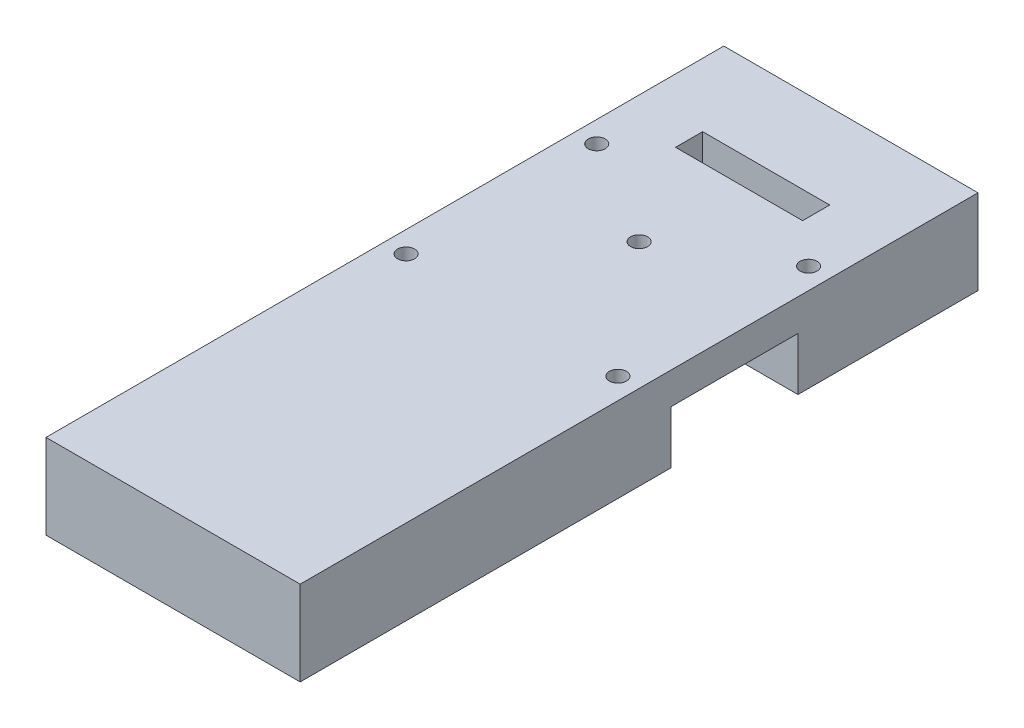
ISO-10303-21;
HEADER;
FILE_DESCRIPTION(('STEP AP214'),'2;1');
FILE_NAME('part.step','',(''),(''),'','','');
FILE_SCHEMA(('AUTOMOTIVE_DESIGN { 1 0 10303 214 1 1 1 1 }'));
ENDSEC;
DATA;
#1=APPLICATION_CONTEXT('core data for automotive mechanical design processes');
#2=APPLICATION_PROTOCOL_DEFINITION('international standard','automotive_design',2000,#1);
#3=PRODUCT_CONTEXT('',#1,'mechanical');
#4=PRODUCT('Part','Part','',(#3));
#5=PRODUCT_RELATED_PRODUCT_CATEGORY('part','',(#4));
#6=PRODUCT_DEFINITION_FORMATION('','',#4);
#7=PRODUCT_DEFINITION_CONTEXT('part definition',#1,'design');
#8=PRODUCT_DEFINITION('design','',#6,#7);
#9=PRODUCT_DEFINITION_SHAPE('','',#8);
#10=(LENGTH_UNIT() NAMED_UNIT(*) SI_UNIT(.MILLI.,.METRE.));
#11=(NAMED_UNIT(*) PLANE_ANGLE_UNIT() SI_UNIT($,.RADIAN.));
#12=(NAMED_UNIT(*) SI_UNIT($,.STERADIAN.) SOLID_ANGLE_UNIT());
#13=UNCERTAINTY_MEASURE_WITH_UNIT(LENGTH_MEASURE(1.E-05),#10,'distance_accuracy_value','');
#14=(GEOMETRIC_REPRESENTATION_CONTEXT(3) GLOBAL_UNCERTAINTY_ASSIGNED_CONTEXT((#13)) GLOBAL_UNIT_ASSIGNED_CONTEXT((#10,
#11,#12)) REPRESENTATION_CONTEXT('',''));
#15=CARTESIAN_POINT('',(0.,0.,0.));
#16=DIRECTION('',(0.,0.,1.));
#17=DIRECTION('',(1.,0.,0.));
#18=AXIS2_PLACEMENT_3D('',#15,#16,#17);
#19=CARTESIAN_POINT('',(0.,12.7,0.));
#20=DIRECTION('',(0.,-1.,0.));
#21=DIRECTION('',(0.,0.,-1.));
#22=AXIS2_PLACEMENT_3D('',#19,#20,#21);
#23=PLANE('',#22);
#24=CARTESIAN_POINT('',(31.75,12.7,-57.15));
#25=DIRECTION('',(0.,-1.,0.));
#26=DIRECTION('',(0.,0.,1.));
#27=AXIS2_PLACEMENT_3D('',#24,#25,#26);
#28=CIRCLE('',#27,2.5527);
#29=CARTESIAN_POINT('',(31.75,12.7,-54.5973));
#30=VERTEX_POINT('',#29);
#31=EDGE_CURVE('E817',#30,#30,#28,.T.);
#32=ORIENTED_EDGE('',*,*,#31,.T.);
#33=EDGE_LOOP('',(#32));
#34=FACE_BOUND('',#33,.T.);
#35=CARTESIAN_POINT('',(31.75,12.7,0.));
#36=DIRECTION('',(0.,-1.,0.));
#37=DIRECTION('',(0.,0.,1.));
#38=AXIS2_PLACEMENT_3D('',#35,#36,#37);
#39=CIRCLE('',#38,2.5527);
#40=CARTESIAN_POINT('',(31.75,12.7,2.55269999999999));
#41=VERTEX_POINT('',#40);
#42=EDGE_CURVE('E825',#41,#41,#39,.T.);
#43=ORIENTED_EDGE('',*,*,#42,.T.);
#44=EDGE_LOOP('',(#43));
#45=FACE_BOUND('',#44,.T.);
#46=CARTESIAN_POINT('',(-31.75,12.7,0.));
#47=DIRECTION('',(0.,-1.,0.));
#48=DIRECTION('',(0.,0.,-1.));
#49=AXIS2_PLACEMENT_3D('',#46,#47,#48);
#50=CIRCLE('',#49,2.5527);
#51=CARTESIAN_POINT('',(-31.75,12.7,-2.5527));
#52=VERTEX_POINT('',#51);
#53=EDGE_CURVE('E831',#52,#52,#50,.T.);
#54=ORIENTED_EDGE('',*,*,#53,.T.);
#55=EDGE_LOOP('',(#54));
#56=FACE_BOUND('',#55,.T.);
#57=CARTESIAN_POINT('',(-31.75,12.7,-57.15));
#58=DIRECTION('',(0.,-1.,0.));
#59=DIRECTION('',(0.,0.,-1.));
#60=AXIS2_PLACEMENT_3D('',#57,#58,#59);
#61=CIRCLE('',#60,2.5527);
#62=CARTESIAN_POINT('',(-31.75,12.7,-59.7027));
#63=VERTEX_POINT('',#62);
#64=EDGE_CURVE('E837',#63,#63,#61,.T.);
#65=ORIENTED_EDGE('',*,*,#64,.T.);
#66=EDGE_LOOP('',(#65));
#67=FACE_BOUND('',#66,.T.);
#68=CARTESIAN_POINT('',(0.,12.7,-38.1));
#69=DIRECTION('',(0.,1.,0.));
#70=DIRECTION('',(0.,0.,1.));
#71=AXIS2_PLACEMENT_3D('',#68,#69,#70);
#72=CIRCLE('',#71,2.5527);
#73=CARTESIAN_POINT('',(0.,12.7,-35.5473));
#74=VERTEX_POINT('',#73);
#75=EDGE_CURVE('E840',#74,#74,#72,.T.);
#76=ORIENTED_EDGE('',*,*,#75,.F.);
#77=EDGE_LOOP('',(#76));
#78=FACE_BOUND('',#77,.T.);
#79=DIRECTION('',(0.,0.,-1.));
#80=VECTOR('',#79,1.);
#81=CARTESIAN_POINT('',(38.1,12.7,101.6));
#82=LINE('',#81,#80);
#83=CARTESIAN_POINT('',(38.1,12.7,101.6));
#84=VERTEX_POINT('',#83);
#85=CARTESIAN_POINT('',(38.1,12.7,-101.6));
#86=VERTEX_POINT('',#85);
#87=EDGE_CURVE('E382',#84,#86,#82,.T.);
#88=ORIENTED_EDGE('',*,*,#87,.T.);
#89=DIRECTION('',(-1.,0.,0.));
#90=VECTOR('',#89,1.);
#91=CARTESIAN_POINT('',(-38.1,12.7,-101.6));
#92=LINE('',#91,#90);
#93=CARTESIAN_POINT('',(-38.1,12.7,-101.6));
#94=VERTEX_POINT('',#93);
#95=EDGE_CURVE('E386',#86,#94,#92,.T.);
#96=ORIENTED_EDGE('',*,*,#95,.T.);
#97=DIRECTION('',(0.,0.,1.));
#98=VECTOR('',#97,1.);
#99=CARTESIAN_POINT('',(-38.1,12.7,101.6));
#100=LINE('',#99,#98);
#101=CARTESIAN_POINT('',(-38.1,12.7,101.6));
#102=VERTEX_POINT('',#101);
#103=EDGE_CURVE('E389',#94,#102,#100,.T.);
#104=ORIENTED_EDGE('',*,*,#103,.T.);
#105=DIRECTION('',(1.,0.,0.));
#106=VECTOR('',#105,1.);
#107=CARTESIAN_POINT('',(-38.1,12.7,101.6));
#108=LINE('',#107,#106);
#109=EDGE_CURVE('E392',#102,#84,#108,.T.);
#110=ORIENTED_EDGE('',*,*,#109,.T.);
#111=EDGE_LOOP('',(#88,#96,#104,#110));
#112=FACE_BOUND('',#111,.T.);
#113=DIRECTION('',(0.,0.,-1.));
#114=VECTOR('',#113,1.);
#115=CARTESIAN_POINT('',(19.05,12.7,-76.2));
#116=LINE('',#115,#114);
#117=CARTESIAN_POINT('',(19.05,12.7,-68.072));
#118=VERTEX_POINT('',#117);
#119=CARTESIAN_POINT('',(19.05,12.7,-76.2));
#120=VERTEX_POINT('',#119);
#121=EDGE_CURVE('E220',#118,#120,#116,.T.);
#122=ORIENTED_EDGE('',*,*,#121,.F.);
#123=DIRECTION('',(1.,0.,0.));
#124=VECTOR('',#123,1.);
#125=CARTESIAN_POINT('',(19.05,12.7,-68.072));
#126=LINE('',#125,#124);
#127=CARTESIAN_POINT('',(-19.05,12.7,-68.072));
#128=VERTEX_POINT('',#127);
#129=EDGE_CURVE('E242',#128,#118,#126,.T.);
#130=ORIENTED_EDGE('',*,*,#129,.F.);
#131=DIRECTION('',(0.,0.,1.));
#132=VECTOR('',#131,1.);
#133=CARTESIAN_POINT('',(-19.05,12.7,-76.2));
#134=LINE('',#133,#132);
#135=CARTESIAN_POINT('',(-19.05,12.7,-76.2));
#136=VERTEX_POINT('',#135);
#137=EDGE_CURVE('E240',#136,#128,#134,.T.);
#138=ORIENTED_EDGE('',*,*,#137,.F.);
#139=DIRECTION('',(-1.,0.,0.));
#140=VECTOR('',#139,1.);
#141=CARTESIAN_POINT('',(19.05,12.7,-76.2));
#142=LINE('',#141,#140);
#143=EDGE_CURVE('E227',#120,#136,#142,.T.);
#144=ORIENTED_EDGE('',*,*,#143,.F.);
#145=EDGE_LOOP('',(#122,#130,#138,#144));
#146=FACE_BOUND('',#145,.T.);
#147=ADVANCED_FACE('F35',(#34,#45,#56,#67,#78,#112,#146),#23,.F.);
#148=CARTESIAN_POINT('',(-22.225,3.175,-73.025));
#149=DIRECTION('',(0.,-1.,0.));
#150=DIRECTION('',(0.,0.,-1.));
#151=AXIS2_PLACEMENT_3D('',#148,#149,#150);
#152=PLANE('',#151);
#153=DIRECTION('',(-1.,0.,0.));
#154=VECTOR('',#153,1.);
#155=CARTESIAN_POINT('',(-22.225,3.175,-68.072));
#156=LINE('',#155,#154);
#157=CARTESIAN_POINT('',(22.225,3.175,-68.072));
#158=VERTEX_POINT('',#157);
#159=CARTESIAN_POINT('',(19.05,3.175,-68.072));
#160=VERTEX_POINT('',#159);
#161=EDGE_CURVE('E267',#158,#160,#156,.T.);
#162=ORIENTED_EDGE('',*,*,#161,.T.);
#163=DIRECTION('',(0.,0.,-1.));
#164=VECTOR('',#163,1.);
#165=CARTESIAN_POINT('',(19.05,3.175,-73.0249999999999));
#166=LINE('',#165,#164);
#167=CARTESIAN_POINT('',(19.05,3.175,-76.2));
#168=VERTEX_POINT('',#167);
#169=EDGE_CURVE('E11',#160,#168,#166,.T.);
#170=ORIENTED_EDGE('',*,*,#169,.T.);
#171=DIRECTION('',(1.,0.,0.));
#172=VECTOR('',#171,1.);
#173=CARTESIAN_POINT('',(22.225,3.175,-76.2));
#174=LINE('',#173,#172);
#175=CARTESIAN_POINT('',(22.225,3.175,-76.2));
#176=VERTEX_POINT('',#175);
#177=EDGE_CURVE('E235',#168,#176,#174,.T.);
#178=ORIENTED_EDGE('',*,*,#177,.T.);
#179=CARTESIAN_POINT('',(22.225,3.175,-73.025));
#180=DIRECTION('',(0.,-1.,0.));
#181=DIRECTION('',(0.,0.,-1.));
#182=AXIS2_PLACEMENT_3D('',#179,#180,#181);
#183=CIRCLE('',#182,3.17500000000001);
#184=CARTESIAN_POINT('',(25.4,3.175,-73.025));
#185=VERTEX_POINT('',#184);
#186=EDGE_CURVE('E257',#176,#185,#183,.T.);
#187=ORIENTED_EDGE('',*,*,#186,.T.);
#188=DIRECTION('',(0.,0.,1.));
#189=VECTOR('',#188,1.);
#190=CARTESIAN_POINT('',(25.4,3.175,-71.247));
#191=LINE('',#190,#189);
#192=CARTESIAN_POINT('',(25.4,3.175,-71.247));
#193=VERTEX_POINT('',#192);
#194=EDGE_CURVE('E260',#185,#193,#191,.T.);
#195=ORIENTED_EDGE('',*,*,#194,.T.);
#196=CARTESIAN_POINT('',(22.225,3.175,-71.247));
#197=DIRECTION('',(0.,-1.,0.));
#198=DIRECTION('',(0.,0.,1.));
#199=AXIS2_PLACEMENT_3D('',#196,#197,#198);
#200=CIRCLE('',#199,3.175);
#201=EDGE_CURVE('E263',#193,#158,#200,.T.);
#202=ORIENTED_EDGE('',*,*,#201,.T.);
#203=EDGE_LOOP('',(#162,#170,#178,#187,#195,#202));
#204=FACE_BOUND('',#203,.T.);
#205=ADVANCED_FACE('F465',(#204),#152,.T.);
#206=CARTESIAN_POINT('',(-22.225,3.175,-76.2));
#207=VERTEX_POINT('',#206);
#208=CARTESIAN_POINT('',(-19.05,3.175,-76.2));
#209=VERTEX_POINT('',#208);
#210=EDGE_CURVE('E254',#207,#209,#174,.T.);
#211=ORIENTED_EDGE('',*,*,#210,.T.);
#212=DIRECTION('',(0.,0.,1.));
#213=VECTOR('',#212,1.);
#214=CARTESIAN_POINT('',(-19.05,3.175,-73.025));
#215=LINE('',#214,#213);
#216=CARTESIAN_POINT('',(-19.05,3.175,-68.072));
#217=VERTEX_POINT('',#216);
#218=EDGE_CURVE('E44',#209,#217,#215,.T.);
#219=ORIENTED_EDGE('',*,*,#218,.T.);
#220=CARTESIAN_POINT('',(-22.225,3.175,-68.072));
#221=VERTEX_POINT('',#220);
#222=EDGE_CURVE('E266',#217,#221,#156,.T.);
#223=ORIENTED_EDGE('',*,*,#222,.T.);
#224=CARTESIAN_POINT('',(-22.225,3.175,-71.247));
#225=DIRECTION('',(0.,-1.,0.));
#226=DIRECTION('',(0.,0.,-1.));
#227=AXIS2_PLACEMENT_3D('',#224,#225,#226);
#228=CIRCLE('',#227,3.175);
#229=CARTESIAN_POINT('',(-25.4,3.175,-71.247));
#230=VERTEX_POINT('',#229);
#231=EDGE_CURVE('E270',#221,#230,#228,.T.);
#232=ORIENTED_EDGE('',*,*,#231,.T.);
#233=DIRECTION('',(0.,0.,-1.));
#234=VECTOR('',#233,1.);
#235=CARTESIAN_POINT('',(-25.4,3.175,-71.247));
#236=LINE('',#235,#234);
#237=CARTESIAN_POINT('',(-25.4,3.175,-73.025));
#238=VERTEX_POINT('',#237);
#239=EDGE_CURVE('E273',#230,#238,#236,.T.);
#240=ORIENTED_EDGE('',*,*,#239,.T.);
#241=CARTESIAN_POINT('',(-22.225,3.175,-73.025));
#242=DIRECTION('',(0.,-1.,0.));
#243=DIRECTION('',(0.,0.,-1.));
#244=AXIS2_PLACEMENT_3D('',#241,#242,#243);
#245=CIRCLE('',#244,3.175);
#246=EDGE_CURVE('E250',#238,#207,#245,.T.);
#247=ORIENTED_EDGE('',*,*,#246,.T.);
#248=EDGE_LOOP('',(#211,#219,#223,#232,#240,#247));
#249=FACE_BOUND('',#248,.T.);
#250=ADVANCED_FACE('F432',(#249),#152,.T.);
#251=CARTESIAN_POINT('',(0.,-12.7,0.));
#252=DIRECTION('',(0.,-1.,0.));
#253=DIRECTION('',(0.,0.,-1.));
#254=AXIS2_PLACEMENT_3D('',#251,#252,#253);
#255=PLANE('',#254);
#256=CARTESIAN_POINT('',(31.75,-12.7,-57.15));
#257=DIRECTION('',(0.,-1.,0.));
#258=DIRECTION('',(0.,0.,1.));
#259=AXIS2_PLACEMENT_3D('',#256,#257,#258);
#260=CIRCLE('',#259,2.5527);
#261=CARTESIAN_POINT('',(31.75,-12.7,-54.5973));
#262=VERTEX_POINT('',#261);
#263=EDGE_CURVE('E820',#262,#262,#260,.T.);
#264=ORIENTED_EDGE('',*,*,#263,.F.);
#265=EDGE_LOOP('',(#264));
#266=FACE_BOUND('',#265,.T.);
#267=CARTESIAN_POINT('',(-31.75,-12.7,-57.15));
#268=DIRECTION('',(0.,-1.,0.));
#269=DIRECTION('',(0.,0.,-1.));
#270=AXIS2_PLACEMENT_3D('',#267,#268,#269);
#271=CIRCLE('',#270,2.5527);
#272=CARTESIAN_POINT('',(-31.75,-12.7,-59.7027));
#273=VERTEX_POINT('',#272);
#274=EDGE_CURVE('E834',#273,#273,#271,.T.);
#275=ORIENTED_EDGE('',*,*,#274,.F.);
#276=EDGE_LOOP('',(#275));
#277=FACE_BOUND('',#276,.T.);
#278=DIRECTION('',(1.,0.,0.));
#279=VECTOR('',#278,1.);
#280=CARTESIAN_POINT('',(22.225,-12.7,-76.2));
#281=LINE('',#280,#279);
#282=CARTESIAN_POINT('',(-22.225,-12.7,-76.2));
#283=VERTEX_POINT('',#282);
#284=CARTESIAN_POINT('',(-4.7625,-12.7,-76.2));
#285=VERTEX_POINT('',#284);
#286=EDGE_CURVE('E280',#283,#285,#281,.T.);
#287=ORIENTED_EDGE('',*,*,#286,.F.);
#288=CARTESIAN_POINT('',(-22.225,-12.7,-73.025));
#289=DIRECTION('',(0.,-1.,0.));
#290=DIRECTION('',(0.,0.,-1.));
#291=AXIS2_PLACEMENT_3D('',#288,#289,#290);
#292=CIRCLE('',#291,3.175);
#293=CARTESIAN_POINT('',(-25.4,-12.7,-73.025));
#294=VERTEX_POINT('',#293);
#295=EDGE_CURVE('E236',#294,#283,#292,.T.);
#296=ORIENTED_EDGE('',*,*,#295,.F.);
#297=DIRECTION('',(0.,0.,-1.));
#298=VECTOR('',#297,1.);
#299=CARTESIAN_POINT('',(-25.4,-12.7,-71.247));
#300=LINE('',#299,#298);
#301=CARTESIAN_POINT('',(-25.4,-12.7,-71.247));
#302=VERTEX_POINT('',#301);
#303=EDGE_CURVE('E253',#302,#294,#300,.T.);
#304=ORIENTED_EDGE('',*,*,#303,.F.);
#305=CARTESIAN_POINT('',(-22.225,-12.7,-71.247));
#306=DIRECTION('',(0.,-1.,0.));
#307=DIRECTION('',(0.,0.,-1.));
#308=AXIS2_PLACEMENT_3D('',#305,#306,#307);
#309=CIRCLE('',#308,3.175);
#310=CARTESIAN_POINT('',(-22.225,-12.7,-68.072));
#311=VERTEX_POINT('',#310);
#312=EDGE_CURVE('E294',#311,#302,#309,.T.);
#313=ORIENTED_EDGE('',*,*,#312,.F.);
#314=DIRECTION('',(-1.,0.,0.));
#315=VECTOR('',#314,1.);
#316=CARTESIAN_POINT('',(-22.225,-12.7,-68.072));
#317=LINE('',#316,#315);
#318=CARTESIAN_POINT('',(22.225,-12.7,-68.072));
#319=VERTEX_POINT('',#318);
#320=EDGE_CURVE('E291',#319,#311,#317,.T.);
#321=ORIENTED_EDGE('',*,*,#320,.F.);
#322=CARTESIAN_POINT('',(22.225,-12.7,-71.247));
#323=DIRECTION('',(0.,-1.,0.));
#324=DIRECTION('',(0.,0.,1.));
#325=AXIS2_PLACEMENT_3D('',#322,#323,#324);
#326=CIRCLE('',#325,3.175);
#327=CARTESIAN_POINT('',(25.4,-12.7,-71.247));
#328=VERTEX_POINT('',#327);
#329=EDGE_CURVE('E288',#328,#319,#326,.T.);
#330=ORIENTED_EDGE('',*,*,#329,.F.);
#331=DIRECTION('',(0.,0.,1.));
#332=VECTOR('',#331,1.);
#333=CARTESIAN_POINT('',(25.4,-12.7,-71.247));
#334=LINE('',#333,#332);
#335=CARTESIAN_POINT('',(25.4,-12.7,-73.025));
#336=VERTEX_POINT('',#335);
#337=EDGE_CURVE('E285',#336,#328,#334,.T.);
#338=ORIENTED_EDGE('',*,*,#337,.F.);
#339=CARTESIAN_POINT('',(22.225,-12.7,-73.025));
#340=DIRECTION('',(0.,-1.,0.));
#341=DIRECTION('',(0.,0.,-1.));
#342=AXIS2_PLACEMENT_3D('',#339,#340,#341);
#343=CIRCLE('',#342,3.17500000000001);
#344=CARTESIAN_POINT('',(22.225,-12.7,-76.2));
#345=VERTEX_POINT('',#344);
#346=EDGE_CURVE('E282',#345,#336,#343,.T.);
#347=ORIENTED_EDGE('',*,*,#346,.F.);
#348=CARTESIAN_POINT('',(4.7625,-12.7,-76.2));
#349=VERTEX_POINT('',#348);
#350=EDGE_CURVE('E279',#349,#345,#281,.T.);
#351=ORIENTED_EDGE('',*,*,#350,.F.);
#352=DIRECTION('',(0.,0.,-1.));
#353=VECTOR('',#352,1.);
#354=CARTESIAN_POINT('',(4.7625,-12.7,-76.2));
#355=LINE('',#354,#353);
#356=CARTESIAN_POINT('',(4.7625,-12.7,-101.6));
#357=VERTEX_POINT('',#356);
#358=EDGE_CURVE('E413',#357,#349,#355,.F.);
#359=ORIENTED_EDGE('',*,*,#358,.F.);
#360=DIRECTION('',(-1.,0.,0.));
#361=VECTOR('',#360,1.);
#362=CARTESIAN_POINT('',(-38.1,-12.7,-101.6));
#363=LINE('',#362,#361);
#364=CARTESIAN_POINT('',(38.1,-12.7,-101.6));
#365=VERTEX_POINT('',#364);
#366=EDGE_CURVE('E400',#365,#357,#363,.T.);
#367=ORIENTED_EDGE('',*,*,#366,.F.);
#368=DIRECTION('',(0.,0.,-1.));
#369=VECTOR('',#368,1.);
#370=CARTESIAN_POINT('',(38.1,-12.7,101.6));
#371=LINE('',#370,#369);
#372=CARTESIAN_POINT('',(38.1,-12.7,-47.625));
#373=VERTEX_POINT('',#372);
#374=EDGE_CURVE('E395',#373,#365,#371,.T.);
#375=ORIENTED_EDGE('',*,*,#374,.F.);
#376=DIRECTION('',(1.,0.,0.));
#377=VECTOR('',#376,1.);
#378=CARTESIAN_POINT('',(0.,-12.7,-47.625));
#379=LINE('',#378,#377);
#380=CARTESIAN_POINT('',(-38.1,-12.7,-47.625));
#381=VERTEX_POINT('',#380);
#382=EDGE_CURVE('E425',#381,#373,#379,.T.);
#383=ORIENTED_EDGE('',*,*,#382,.F.);
#384=DIRECTION('',(0.,0.,1.));
#385=VECTOR('',#384,1.);
#386=CARTESIAN_POINT('',(-38.1,-12.7,101.6));
#387=LINE('',#386,#385);
#388=CARTESIAN_POINT('',(-38.1,-12.7,-101.6));
#389=VERTEX_POINT('',#388);
#390=EDGE_CURVE('E404',#389,#381,#387,.T.);
#391=ORIENTED_EDGE('',*,*,#390,.F.);
#392=CARTESIAN_POINT('',(-4.7625,-12.7,-101.6));
#393=VERTEX_POINT('',#392);
#394=EDGE_CURVE('E399',#393,#389,#363,.T.);
#395=ORIENTED_EDGE('',*,*,#394,.F.);
#396=DIRECTION('',(0.,0.,-1.));
#397=VECTOR('',#396,1.);
#398=CARTESIAN_POINT('',(-4.7625,-12.7,-76.2));
#399=LINE('',#398,#397);
#400=EDGE_CURVE('E421',#285,#393,#399,.T.);
#401=ORIENTED_EDGE('',*,*,#400,.F.);
#402=EDGE_LOOP('',(#287,#296,#304,#313,#321,#330,#338,#347,#351,#359,#367,#375,#383,#391,#395,#401));
#403=FACE_BOUND('',#402,.T.);
#404=ADVANCED_FACE('F486',(#266,#277,#403),#255,.T.);
#405=CARTESIAN_POINT('',(38.1,-12.7,101.6));
#406=DIRECTION('',(1.,0.,0.));
#407=DIRECTION('',(0.,0.,-1.));
#408=AXIS2_PLACEMENT_3D('',#405,#406,#407);
#409=PLANE('',#408);
#410=DIRECTION('',(0.,1.,0.));
#411=VECTOR('',#410,1.);
#412=CARTESIAN_POINT('',(38.1,-12.7,-47.625));
#413=LINE('',#412,#411);
#414=CARTESIAN_POINT('',(38.1,3.175,-47.625));
#415=VERTEX_POINT('',#414);
#416=EDGE_CURVE('E374',#373,#415,#413,.T.);
#417=ORIENTED_EDGE('',*,*,#416,.F.);
#418=ORIENTED_EDGE('',*,*,#374,.T.);
#419=DIRECTION('',(0.,1.,0.));
#420=VECTOR('',#419,1.);
#421=CARTESIAN_POINT('',(38.1,-12.7,-101.6));
#422=LINE('',#421,#420);
#423=EDGE_CURVE('E410',#365,#86,#422,.T.);
#424=ORIENTED_EDGE('',*,*,#423,.T.);
#425=ORIENTED_EDGE('',*,*,#87,.F.);
#426=DIRECTION('',(0.,1.,0.));
#427=VECTOR('',#426,1.);
#428=CARTESIAN_POINT('',(38.1,-12.7,101.6));
#429=LINE('',#428,#427);
#430=CARTESIAN_POINT('',(38.1,-12.7,101.6));
#431=VERTEX_POINT('',#430);
#432=EDGE_CURVE('E411',#431,#84,#429,.T.);
#433=ORIENTED_EDGE('',*,*,#432,.F.);
#434=CARTESIAN_POINT('',(38.1,-12.7,-9.52500000000001));
#435=VERTEX_POINT('',#434);
#436=EDGE_CURVE('E396',#431,#435,#371,.T.);
#437=ORIENTED_EDGE('',*,*,#436,.T.);
#438=DIRECTION('',(0.,-1.,0.));
#439=VECTOR('',#438,1.);
#440=CARTESIAN_POINT('',(38.1,-12.7,-9.52500000000001));
#441=LINE('',#440,#439);
#442=CARTESIAN_POINT('',(38.1,3.175,-9.52500000000001));
#443=VERTEX_POINT('',#442);
#444=EDGE_CURVE('E358',#443,#435,#441,.T.);
#445=ORIENTED_EDGE('',*,*,#444,.F.);
#446=DIRECTION('',(0.,0.,-1.));
#447=VECTOR('',#446,1.);
#448=CARTESIAN_POINT('',(38.1,3.175,101.6));
#449=LINE('',#448,#447);
#450=EDGE_CURVE('E376',#443,#415,#449,.T.);
#451=ORIENTED_EDGE('',*,*,#450,.T.);
#452=EDGE_LOOP('',(#417,#418,#424,#425,#433,#437,#445,#451));
#453=FACE_BOUND('',#452,.T.);
#454=ADVANCED_FACE('F37',(#453),#409,.T.);
#455=CARTESIAN_POINT('',(-38.1,-12.7,101.6));
#456=DIRECTION('',(0.,0.,1.));
#457=DIRECTION('',(1.,0.,0.));
#458=AXIS2_PLACEMENT_3D('',#455,#456,#457);
#459=PLANE('',#458);
#460=ORIENTED_EDGE('',*,*,#432,.T.);
#461=ORIENTED_EDGE('',*,*,#109,.F.);
#462=DIRECTION('',(0.,1.,0.));
#463=VECTOR('',#462,1.);
#464=CARTESIAN_POINT('',(-38.1,-12.7,101.6));
#465=LINE('',#464,#463);
#466=CARTESIAN_POINT('',(-38.1,-12.7,101.6));
#467=VERTEX_POINT('',#466);
#468=EDGE_CURVE('E414',#467,#102,#465,.T.);
#469=ORIENTED_EDGE('',*,*,#468,.F.);
#470=DIRECTION('',(1.,0.,0.));
#471=VECTOR('',#470,1.);
#472=CARTESIAN_POINT('',(-38.1,-12.7,101.6));
#473=LINE('',#472,#471);
#474=EDGE_CURVE('E407',#467,#431,#473,.T.);
#475=ORIENTED_EDGE('',*,*,#474,.T.);
#476=EDGE_LOOP('',(#460,#461,#469,#475));
#477=FACE_BOUND('',#476,.T.);
#478=ADVANCED_FACE('F487',(#477),#459,.T.);
#479=CARTESIAN_POINT('',(-38.1,-12.7,101.6));
#480=DIRECTION('',(-1.,0.,0.));
#481=DIRECTION('',(0.,0.,1.));
#482=AXIS2_PLACEMENT_3D('',#479,#480,#481);
#483=PLANE('',#482);
#484=DIRECTION('',(0.,-1.,0.));
#485=VECTOR('',#484,1.);
#486=CARTESIAN_POINT('',(-38.1,-12.7,-47.625));
#487=LINE('',#486,#485);
#488=CARTESIAN_POINT('',(-38.1,3.175,-47.625));
#489=VERTEX_POINT('',#488);
#490=EDGE_CURVE('E372',#489,#381,#487,.T.);
#491=ORIENTED_EDGE('',*,*,#490,.F.);
#492=DIRECTION('',(0.,0.,1.));
#493=VECTOR('',#492,1.);
#494=CARTESIAN_POINT('',(-38.1,3.175,101.6));
#495=LINE('',#494,#493);
#496=CARTESIAN_POINT('',(-38.1,3.175,-9.52500000000001));
#497=VERTEX_POINT('',#496);
#498=EDGE_CURVE('E427',#489,#497,#495,.T.);
#499=ORIENTED_EDGE('',*,*,#498,.T.);
#500=DIRECTION('',(0.,1.,0.));
#501=VECTOR('',#500,1.);
#502=CARTESIAN_POINT('',(-38.1,-12.7,-9.52500000000001));
#503=LINE('',#502,#501);
#504=CARTESIAN_POINT('',(-38.1,-12.7,-9.52500000000001));
#505=VERTEX_POINT('',#504);
#506=EDGE_CURVE('E370',#505,#497,#503,.T.);
#507=ORIENTED_EDGE('',*,*,#506,.F.);
#508=EDGE_CURVE('E403',#505,#467,#387,.T.);
#509=ORIENTED_EDGE('',*,*,#508,.T.);
#510=ORIENTED_EDGE('',*,*,#468,.T.);
#511=ORIENTED_EDGE('',*,*,#103,.F.);
#512=DIRECTION('',(0.,1.,0.));
#513=VECTOR('',#512,1.);
#514=CARTESIAN_POINT('',(-38.1,-12.7,-101.6));
#515=LINE('',#514,#513);
#516=EDGE_CURVE('E416',#389,#94,#515,.T.);
#517=ORIENTED_EDGE('',*,*,#516,.F.);
#518=ORIENTED_EDGE('',*,*,#390,.T.);
#519=EDGE_LOOP('',(#491,#499,#507,#509,#510,#511,#517,#518));
#520=FACE_BOUND('',#519,.T.);
#521=ADVANCED_FACE('F490',(#520),#483,.T.);
#522=CARTESIAN_POINT('',(-38.1,-12.7,-101.6));
#523=DIRECTION('',(0.,0.,-1.));
#524=DIRECTION('',(-1.,0.,0.));
#525=AXIS2_PLACEMENT_3D('',#522,#523,#524);
#526=PLANE('',#525);
#527=CARTESIAN_POINT('',(0.,-12.7,-101.6));
#528=DIRECTION('',(0.,0.,-1.));
#529=DIRECTION('',(-1.,0.,0.));
#530=AXIS2_PLACEMENT_3D('',#527,#528,#529);
#531=CIRCLE('',#530,4.7625);
#532=EDGE_CURVE('E379',#393,#357,#531,.T.);
#533=ORIENTED_EDGE('',*,*,#532,.F.);
#534=ORIENTED_EDGE('',*,*,#394,.T.);
#535=ORIENTED_EDGE('',*,*,#516,.T.);
#536=ORIENTED_EDGE('',*,*,#95,.F.);
#537=ORIENTED_EDGE('',*,*,#423,.F.);
#538=ORIENTED_EDGE('',*,*,#366,.T.);
#539=EDGE_LOOP('',(#533,#534,#535,#536,#537,#538));
#540=FACE_BOUND('',#539,.T.);
#541=ADVANCED_FACE('F484',(#540),#526,.T.);
#542=CARTESIAN_POINT('',(31.75,-12.7,0.));
#543=DIRECTION('',(0.,-1.,0.));
#544=DIRECTION('',(0.,0.,1.));
#545=AXIS2_PLACEMENT_3D('',#542,#543,#544);
#546=CIRCLE('',#545,2.5527);
#547=CARTESIAN_POINT('',(31.75,-12.7,2.55269999999999));
#548=VERTEX_POINT('',#547);
#549=EDGE_CURVE('E822',#548,#548,#546,.T.);
#550=ORIENTED_EDGE('',*,*,#549,.F.);
#551=EDGE_LOOP('',(#550));
#552=FACE_BOUND('',#551,.T.);
#553=CARTESIAN_POINT('',(-31.75,-12.7,0.));
#554=DIRECTION('',(0.,-1.,0.));
#555=DIRECTION('',(0.,0.,-1.));
#556=AXIS2_PLACEMENT_3D('',#553,#554,#555);
#557=CIRCLE('',#556,2.5527);
#558=CARTESIAN_POINT('',(-31.75,-12.7,-2.5527));
#559=VERTEX_POINT('',#558);
#560=EDGE_CURVE('E828',#559,#559,#557,.T.);
#561=ORIENTED_EDGE('',*,*,#560,.F.);
#562=EDGE_LOOP('',(#561));
#563=FACE_BOUND('',#562,.T.);
#564=DIRECTION('',(-1.,0.,0.));
#565=VECTOR('',#564,1.);
#566=CARTESIAN_POINT('',(-25.4,-12.7,-9.52500000000001));
#567=LINE('',#566,#565);
#568=CARTESIAN_POINT('',(-25.4,-12.7,-9.52500000000001));
#569=VERTEX_POINT('',#568);
#570=EDGE_CURVE('E319',#569,#505,#567,.T.);
#571=ORIENTED_EDGE('',*,*,#570,.F.);
#572=DIRECTION('',(0.,0.,-1.));
#573=VECTOR('',#572,1.);
#574=CARTESIAN_POINT('',(-25.4,-12.7,90.4875));
#575=LINE('',#574,#573);
#576=CARTESIAN_POINT('',(-25.4,-12.7,90.4875));
#577=VERTEX_POINT('',#576);
#578=EDGE_CURVE('E352',#577,#569,#575,.T.);
#579=ORIENTED_EDGE('',*,*,#578,.F.);
#580=CARTESIAN_POINT('',(-19.05,-12.7,90.4875));
#581=DIRECTION('',(0.,-1.,0.));
#582=DIRECTION('',(0.,0.,-1.));
#583=AXIS2_PLACEMENT_3D('',#580,#581,#582);
#584=CIRCLE('',#583,6.34999999999999);
#585=CARTESIAN_POINT('',(-19.05,-12.7,96.8375));
#586=VERTEX_POINT('',#585);
#587=EDGE_CURVE('E349',#586,#577,#584,.T.);
#588=ORIENTED_EDGE('',*,*,#587,.F.);
#589=DIRECTION('',(-1.,0.,0.));
#590=VECTOR('',#589,1.);
#591=CARTESIAN_POINT('',(19.05,-12.7,96.8375));
#592=LINE('',#591,#590);
#593=CARTESIAN_POINT('',(19.05,-12.7,96.8375));
#594=VERTEX_POINT('',#593);
#595=EDGE_CURVE('E346',#594,#586,#592,.T.);
#596=ORIENTED_EDGE('',*,*,#595,.F.);
#597=CARTESIAN_POINT('',(19.05,-12.7,90.4875));
#598=DIRECTION('',(0.,-1.,0.));
#599=DIRECTION('',(0.,0.,-1.));
#600=AXIS2_PLACEMENT_3D('',#597,#598,#599);
#601=CIRCLE('',#600,6.34999999999999);
#602=CARTESIAN_POINT('',(25.4,-12.7,90.4875));
#603=VERTEX_POINT('',#602);
#604=EDGE_CURVE('E343',#603,#594,#601,.T.);
#605=ORIENTED_EDGE('',*,*,#604,.F.);
#606=DIRECTION('',(0.,0.,1.));
#607=VECTOR('',#606,1.);
#608=CARTESIAN_POINT('',(25.4,-12.7,90.4875));
#609=LINE('',#608,#607);
#610=CARTESIAN_POINT('',(25.4,-12.7,-9.52500000000001));
#611=VERTEX_POINT('',#610);
#612=EDGE_CURVE('E301',#611,#603,#609,.T.);
#613=ORIENTED_EDGE('',*,*,#612,.F.);
#614=DIRECTION('',(-1.,0.,0.));
#615=VECTOR('',#614,1.);
#616=CARTESIAN_POINT('',(0.,-12.7,-9.52500000000001));
#617=LINE('',#616,#615);
#618=EDGE_CURVE('E423',#435,#611,#617,.T.);
#619=ORIENTED_EDGE('',*,*,#618,.F.);
#620=ORIENTED_EDGE('',*,*,#436,.F.);
#621=ORIENTED_EDGE('',*,*,#474,.F.);
#622=ORIENTED_EDGE('',*,*,#508,.F.);
#623=EDGE_LOOP('',(#571,#579,#588,#596,#605,#613,#619,#620,#621,#622));
#624=FACE_BOUND('',#623,.T.);
#625=ADVANCED_FACE('F481',(#552,#563,#624),#255,.T.);
#626=CARTESIAN_POINT('',(0.,-12.7,-76.2));
#627=DIRECTION('',(0.,0.,-1.));
#628=DIRECTION('',(-1.,0.,0.));
#629=AXIS2_PLACEMENT_3D('',#626,#627,#628);
#630=CYLINDRICAL_SURFACE('',#629,4.7625);
#631=ORIENTED_EDGE('',*,*,#400,.T.);
#632=ORIENTED_EDGE('',*,*,#532,.T.);
#633=ORIENTED_EDGE('',*,*,#358,.T.);
#634=CARTESIAN_POINT('',(0.,-12.7,-76.2));
#635=DIRECTION('',(0.,0.,-1.));
#636=DIRECTION('',(-1.,0.,0.));
#637=AXIS2_PLACEMENT_3D('',#634,#635,#636);
#638=CIRCLE('',#637,4.7625);
#639=EDGE_CURVE('E380',#285,#349,#638,.T.);
#640=ORIENTED_EDGE('',*,*,#639,.F.);
#641=EDGE_LOOP('',(#631,#632,#633,#640));
#642=FACE_BOUND('',#641,.T.);
#643=ADVANCED_FACE('F479',(#642),#630,.F.);
#644=CARTESIAN_POINT('',(44.45,3.175,-47.625));
#645=DIRECTION('',(0.,0.,-1.));
#646=DIRECTION('',(-1.,0.,0.));
#647=AXIS2_PLACEMENT_3D('',#644,#645,#646);
#648=PLANE('',#647);
#649=ORIENTED_EDGE('',*,*,#416,.T.);
#650=DIRECTION('',(1.,0.,0.));
#651=VECTOR('',#650,1.);
#652=CARTESIAN_POINT('',(44.45,3.175,-47.625));
#653=LINE('',#652,#651);
#654=EDGE_CURVE('E337',#489,#415,#653,.T.);
#655=ORIENTED_EDGE('',*,*,#654,.F.);
#656=ORIENTED_EDGE('',*,*,#490,.T.);
#657=ORIENTED_EDGE('',*,*,#382,.T.);
#658=EDGE_LOOP('',(#649,#655,#656,#657));
#659=FACE_BOUND('',#658,.T.);
#660=ADVANCED_FACE('F550',(#659),#648,.F.);
#661=CARTESIAN_POINT('',(-25.4,3.175,-9.52500000000001));
#662=DIRECTION('',(0.,0.,1.));
#663=DIRECTION('',(1.,0.,0.));
#664=AXIS2_PLACEMENT_3D('',#661,#662,#663);
#665=PLANE('',#664);
#666=ORIENTED_EDGE('',*,*,#506,.T.);
#667=DIRECTION('',(-1.,0.,0.));
#668=VECTOR('',#667,1.);
#669=CARTESIAN_POINT('',(-25.4,3.175,-9.52500000000001));
#670=LINE('',#669,#668);
#671=CARTESIAN_POINT('',(-25.4,3.175,-9.52500000000001));
#672=VERTEX_POINT('',#671);
#673=EDGE_CURVE('E334',#672,#497,#670,.T.);
#674=ORIENTED_EDGE('',*,*,#673,.F.);
#675=DIRECTION('',(0.,-1.,0.));
#676=VECTOR('',#675,1.);
#677=CARTESIAN_POINT('',(-25.4,3.175,-9.52500000000001));
#678=LINE('',#677,#676);
#679=EDGE_CURVE('E356',#672,#569,#678,.T.);
#680=ORIENTED_EDGE('',*,*,#679,.T.);
#681=ORIENTED_EDGE('',*,*,#570,.T.);
#682=EDGE_LOOP('',(#666,#674,#680,#681));
#683=FACE_BOUND('',#682,.T.);
#684=ADVANCED_FACE('F553',(#683),#665,.F.);
#685=CARTESIAN_POINT('',(-25.4,3.175,90.4875));
#686=DIRECTION('',(-1.,0.,0.));
#687=DIRECTION('',(0.,0.,1.));
#688=AXIS2_PLACEMENT_3D('',#685,#686,#687);
#689=PLANE('',#688);
#690=ORIENTED_EDGE('',*,*,#578,.T.);
#691=ORIENTED_EDGE('',*,*,#679,.F.);
#692=DIRECTION('',(0.,0.,-1.));
#693=VECTOR('',#692,1.);
#694=CARTESIAN_POINT('',(-25.4,3.175,90.4875));
#695=LINE('',#694,#693);
#696=CARTESIAN_POINT('',(-25.4,3.175,90.4875));
#697=VERTEX_POINT('',#696);
#698=EDGE_CURVE('E331',#697,#672,#695,.T.);
#699=ORIENTED_EDGE('',*,*,#698,.F.);
#700=DIRECTION('',(0.,-1.,0.));
#701=VECTOR('',#700,1.);
#702=CARTESIAN_POINT('',(-25.4,3.175,90.4875));
#703=LINE('',#702,#701);
#704=EDGE_CURVE('E359',#697,#577,#703,.T.);
#705=ORIENTED_EDGE('',*,*,#704,.T.);
#706=EDGE_LOOP('',(#690,#691,#699,#705));
#707=FACE_BOUND('',#706,.T.);
#708=ADVANCED_FACE('F557',(#707),#689,.F.);
#709=CARTESIAN_POINT('',(-19.05,3.175,90.4875));
#710=DIRECTION('',(0.,-1.,0.));
#711=DIRECTION('',(0.,0.,-1.));
#712=AXIS2_PLACEMENT_3D('',#709,#710,#711);
#713=CYLINDRICAL_SURFACE('',#712,6.34999999999999);
#714=ORIENTED_EDGE('',*,*,#587,.T.);
#715=ORIENTED_EDGE('',*,*,#704,.F.);
#716=CARTESIAN_POINT('',(-19.05,3.175,90.4875));
#717=DIRECTION('',(0.,-1.,0.));
#718=DIRECTION('',(0.,0.,-1.));
#719=AXIS2_PLACEMENT_3D('',#716,#717,#718);
#720=CIRCLE('',#719,6.34999999999999);
#721=CARTESIAN_POINT('',(-19.05,3.175,96.8375));
#722=VERTEX_POINT('',#721);
#723=EDGE_CURVE('E328',#722,#697,#720,.T.);
#724=ORIENTED_EDGE('',*,*,#723,.F.);
#725=DIRECTION('',(0.,-1.,0.));
#726=VECTOR('',#725,1.);
#727=CARTESIAN_POINT('',(-19.05,3.175,96.8375));
#728=LINE('',#727,#726);
#729=EDGE_CURVE('E361',#722,#586,#728,.T.);
#730=ORIENTED_EDGE('',*,*,#729,.T.);
#731=EDGE_LOOP('',(#714,#715,#724,#730));
#732=FACE_BOUND('',#731,.T.);
#733=ADVANCED_FACE('F561',(#732),#713,.F.);
#734=CARTESIAN_POINT('',(19.05,3.175,96.8375));
#735=DIRECTION('',(0.,0.,1.));
#736=DIRECTION('',(1.,0.,0.));
#737=AXIS2_PLACEMENT_3D('',#734,#735,#736);
#738=PLANE('',#737);
#739=ORIENTED_EDGE('',*,*,#595,.T.);
#740=ORIENTED_EDGE('',*,*,#729,.F.);
#741=DIRECTION('',(-1.,0.,0.));
#742=VECTOR('',#741,1.);
#743=CARTESIAN_POINT('',(19.05,3.175,96.8375));
#744=LINE('',#743,#742);
#745=CARTESIAN_POINT('',(19.05,3.175,96.8375));
#746=VERTEX_POINT('',#745);
#747=EDGE_CURVE('E325',#746,#722,#744,.T.);
#748=ORIENTED_EDGE('',*,*,#747,.F.);
#749=DIRECTION('',(0.,-1.,0.));
#750=VECTOR('',#749,1.);
#751=CARTESIAN_POINT('',(19.05,3.175,96.8375));
#752=LINE('',#751,#750);
#753=EDGE_CURVE('E363',#746,#594,#752,.T.);
#754=ORIENTED_EDGE('',*,*,#753,.T.);
#755=EDGE_LOOP('',(#739,#740,#748,#754));
#756=FACE_BOUND('',#755,.T.);
#757=ADVANCED_FACE('F565',(#756),#738,.F.);
#758=CARTESIAN_POINT('',(19.05,3.175,90.4875));
#759=DIRECTION('',(0.,-1.,0.));
#760=DIRECTION('',(0.,0.,-1.));
#761=AXIS2_PLACEMENT_3D('',#758,#759,#760);
#762=CYLINDRICAL_SURFACE('',#761,6.34999999999999);
#763=ORIENTED_EDGE('',*,*,#604,.T.);
#764=ORIENTED_EDGE('',*,*,#753,.F.);
#765=CARTESIAN_POINT('',(19.05,3.175,90.4875));
#766=DIRECTION('',(0.,-1.,0.));
#767=DIRECTION('',(0.,0.,-1.));
#768=AXIS2_PLACEMENT_3D('',#765,#766,#767);
#769=CIRCLE('',#768,6.34999999999999);
#770=CARTESIAN_POINT('',(25.4,3.175,90.4875));
#771=VERTEX_POINT('',#770);
#772=EDGE_CURVE('E322',#771,#746,#769,.T.);
#773=ORIENTED_EDGE('',*,*,#772,.F.);
#774=DIRECTION('',(0.,-1.,0.));
#775=VECTOR('',#774,1.);
#776=CARTESIAN_POINT('',(25.4,3.175,90.4875));
#777=LINE('',#776,#775);
#778=EDGE_CURVE('E365',#771,#603,#777,.T.);
#779=ORIENTED_EDGE('',*,*,#778,.T.);
#780=EDGE_LOOP('',(#763,#764,#773,#779));
#781=FACE_BOUND('',#780,.T.);
#782=ADVANCED_FACE('F569',(#781),#762,.F.);
#783=CARTESIAN_POINT('',(25.4,3.175,90.4875));
#784=DIRECTION('',(1.,0.,0.));
#785=DIRECTION('',(0.,0.,-1.));
#786=AXIS2_PLACEMENT_3D('',#783,#784,#785);
#787=PLANE('',#786);
#788=ORIENTED_EDGE('',*,*,#612,.T.);
#789=ORIENTED_EDGE('',*,*,#778,.F.);
#790=DIRECTION('',(0.,0.,1.));
#791=VECTOR('',#790,1.);
#792=CARTESIAN_POINT('',(25.4,3.175,90.4875));
#793=LINE('',#792,#791);
#794=CARTESIAN_POINT('',(25.4,3.175,-9.52500000000001));
#795=VERTEX_POINT('',#794);
#796=EDGE_CURVE('E318',#795,#771,#793,.T.);
#797=ORIENTED_EDGE('',*,*,#796,.F.);
#798=DIRECTION('',(0.,-1.,0.));
#799=VECTOR('',#798,1.);
#800=CARTESIAN_POINT('',(25.4,3.175,-9.52500000000001));
#801=LINE('',#800,#799);
#802=EDGE_CURVE('E340',#795,#611,#801,.T.);
#803=ORIENTED_EDGE('',*,*,#802,.T.);
#804=EDGE_LOOP('',(#788,#789,#797,#803));
#805=FACE_BOUND('',#804,.T.);
#806=ADVANCED_FACE('F573',(#805),#787,.F.);
#807=CARTESIAN_POINT('',(44.45,3.175,-9.52500000000001));
#808=DIRECTION('',(0.,0.,1.));
#809=DIRECTION('',(1.,0.,0.));
#810=AXIS2_PLACEMENT_3D('',#807,#808,#809);
#811=PLANE('',#810);
#812=ORIENTED_EDGE('',*,*,#444,.T.);
#813=ORIENTED_EDGE('',*,*,#618,.T.);
#814=ORIENTED_EDGE('',*,*,#802,.F.);
#815=DIRECTION('',(-1.,0.,0.));
#816=VECTOR('',#815,1.);
#817=CARTESIAN_POINT('',(44.45,3.175,-9.52500000000001));
#818=LINE('',#817,#816);
#819=EDGE_CURVE('E316',#443,#795,#818,.T.);
#820=ORIENTED_EDGE('',*,*,#819,.F.);
#821=EDGE_LOOP('',(#812,#813,#814,#820));
#822=FACE_BOUND('',#821,.T.);
#823=ADVANCED_FACE('F548',(#822),#811,.F.);
#824=CARTESIAN_POINT('',(-19.05,3.175,90.4875));
#825=DIRECTION('',(0.,-1.,0.));
#826=DIRECTION('',(0.,0.,-1.));
#827=AXIS2_PLACEMENT_3D('',#824,#825,#826);
#828=PLANE('',#827);
#829=CARTESIAN_POINT('',(0.,3.175,-38.1));
#830=DIRECTION('',(0.,-1.,0.));
#831=DIRECTION('',(0.,0.,-1.));
#832=AXIS2_PLACEMENT_3D('',#829,#830,#831);
#833=CIRCLE('',#832,2.5527);
#834=CARTESIAN_POINT('',(0.,3.175,-40.6527));
#835=VERTEX_POINT('',#834);
#836=EDGE_CURVE('E39',#835,#835,#833,.T.);
#837=ORIENTED_EDGE('',*,*,#836,.F.);
#838=EDGE_LOOP('',(#837));
#839=FACE_BOUND('',#838,.T.);
#840=ORIENTED_EDGE('',*,*,#819,.T.);
#841=ORIENTED_EDGE('',*,*,#796,.T.);
#842=ORIENTED_EDGE('',*,*,#772,.T.);
#843=ORIENTED_EDGE('',*,*,#747,.T.);
#844=ORIENTED_EDGE('',*,*,#723,.T.);
#845=ORIENTED_EDGE('',*,*,#698,.T.);
#846=ORIENTED_EDGE('',*,*,#673,.T.);
#847=ORIENTED_EDGE('',*,*,#498,.F.);
#848=ORIENTED_EDGE('',*,*,#654,.T.);
#849=ORIENTED_EDGE('',*,*,#450,.F.);
#850=EDGE_LOOP('',(#840,#841,#842,#843,#844,#845,#846,#847,#848,#849));
#851=FACE_BOUND('',#850,.T.);
#852=ADVANCED_FACE('F543',(#839,#851),#828,.T.);
#853=CARTESIAN_POINT('',(22.225,3.175,-76.2));
#854=DIRECTION('',(0.,0.,-1.));
#855=DIRECTION('',(-1.,0.,0.));
#856=AXIS2_PLACEMENT_3D('',#853,#854,#855);
#857=PLANE('',#856);
#858=ORIENTED_EDGE('',*,*,#177,.F.);
#859=DIRECTION('',(0.,-1.,0.));
#860=VECTOR('',#859,1.);
#861=CARTESIAN_POINT('',(19.05,12.7,-76.2));
#862=LINE('',#861,#860);
#863=EDGE_CURVE('E223',#120,#168,#862,.T.);
#864=ORIENTED_EDGE('',*,*,#863,.F.);
#865=ORIENTED_EDGE('',*,*,#143,.T.);
#866=DIRECTION('',(0.,-1.,0.));
#867=VECTOR('',#866,1.);
#868=CARTESIAN_POINT('',(-19.05,12.7,-76.2));
#869=LINE('',#868,#867);
#870=EDGE_CURVE('E237',#136,#209,#869,.T.);
#871=ORIENTED_EDGE('',*,*,#870,.T.);
#872=ORIENTED_EDGE('',*,*,#210,.F.);
#873=DIRECTION('',(0.,-1.,0.));
#874=VECTOR('',#873,1.);
#875=CARTESIAN_POINT('',(-22.225,3.175,-76.2));
#876=LINE('',#875,#874);
#877=EDGE_CURVE('E276',#207,#283,#876,.T.);
#878=ORIENTED_EDGE('',*,*,#877,.T.);
#879=ORIENTED_EDGE('',*,*,#286,.T.);
#880=ORIENTED_EDGE('',*,*,#639,.T.);
#881=ORIENTED_EDGE('',*,*,#350,.T.);
#882=DIRECTION('',(0.,-1.,0.));
#883=VECTOR('',#882,1.);
#884=CARTESIAN_POINT('',(22.225,3.175,-76.2));
#885=LINE('',#884,#883);
#886=EDGE_CURVE('E312',#176,#345,#885,.T.);
#887=ORIENTED_EDGE('',*,*,#886,.F.);
#888=EDGE_LOOP('',(#858,#864,#865,#871,#872,#878,#879,#880,#881,#887));
#889=FACE_BOUND('',#888,.T.);
#890=ADVANCED_FACE('F231',(#889),#857,.F.);
#891=CARTESIAN_POINT('',(-22.225,3.175,-73.025));
#892=DIRECTION('',(0.,-1.,0.));
#893=DIRECTION('',(0.,0.,-1.));
#894=AXIS2_PLACEMENT_3D('',#891,#892,#893);
#895=CYLINDRICAL_SURFACE('',#894,3.175);
#896=ORIENTED_EDGE('',*,*,#295,.T.);
#897=ORIENTED_EDGE('',*,*,#877,.F.);
#898=ORIENTED_EDGE('',*,*,#246,.F.);
#899=DIRECTION('',(0.,-1.,0.));
#900=VECTOR('',#899,1.);
#901=CARTESIAN_POINT('',(-25.4,3.175,-73.025));
#902=LINE('',#901,#900);
#903=EDGE_CURVE('E299',#238,#294,#902,.T.);
#904=ORIENTED_EDGE('',*,*,#903,.T.);
#905=EDGE_LOOP('',(#896,#897,#898,#904));
#906=FACE_BOUND('',#905,.T.);
#907=ADVANCED_FACE('F449',(#906),#895,.F.);
#908=CARTESIAN_POINT('',(-25.4,3.175,-71.247));
#909=DIRECTION('',(-1.,0.,0.));
#910=DIRECTION('',(0.,0.,1.));
#911=AXIS2_PLACEMENT_3D('',#908,#909,#910);
#912=PLANE('',#911);
#913=ORIENTED_EDGE('',*,*,#303,.T.);
#914=ORIENTED_EDGE('',*,*,#903,.F.);
#915=ORIENTED_EDGE('',*,*,#239,.F.);
#916=DIRECTION('',(0.,-1.,0.));
#917=VECTOR('',#916,1.);
#918=CARTESIAN_POINT('',(-25.4,3.175,-71.247));
#919=LINE('',#918,#917);
#920=EDGE_CURVE('E302',#230,#302,#919,.T.);
#921=ORIENTED_EDGE('',*,*,#920,.T.);
#922=EDGE_LOOP('',(#913,#914,#915,#921));
#923=FACE_BOUND('',#922,.T.);
#924=ADVANCED_FACE('F444',(#923),#912,.F.);
#925=CARTESIAN_POINT('',(-22.225,3.175,-71.247));
#926=DIRECTION('',(0.,-1.,0.));
#927=DIRECTION('',(0.,0.,-1.));
#928=AXIS2_PLACEMENT_3D('',#925,#926,#927);
#929=CYLINDRICAL_SURFACE('',#928,3.175);
#930=ORIENTED_EDGE('',*,*,#312,.T.);
#931=ORIENTED_EDGE('',*,*,#920,.F.);
#932=ORIENTED_EDGE('',*,*,#231,.F.);
#933=DIRECTION('',(0.,-1.,0.));
#934=VECTOR('',#933,1.);
#935=CARTESIAN_POINT('',(-22.225,3.175,-68.072));
#936=LINE('',#935,#934);
#937=EDGE_CURVE('E304',#221,#311,#936,.T.);
#938=ORIENTED_EDGE('',*,*,#937,.T.);
#939=EDGE_LOOP('',(#930,#931,#932,#938));
#940=FACE_BOUND('',#939,.T.);
#941=ADVANCED_FACE('F441',(#940),#929,.F.);
#942=CARTESIAN_POINT('',(-22.225,3.175,-68.072));
#943=DIRECTION('',(0.,0.,1.));
#944=DIRECTION('',(1.,0.,0.));
#945=AXIS2_PLACEMENT_3D('',#942,#943,#944);
#946=PLANE('',#945);
#947=ORIENTED_EDGE('',*,*,#222,.F.);
#948=DIRECTION('',(0.,-1.,0.));
#949=VECTOR('',#948,1.);
#950=CARTESIAN_POINT('',(-19.05,12.7,-68.072));
#951=LINE('',#950,#949);
#952=EDGE_CURVE('E51',#128,#217,#951,.T.);
#953=ORIENTED_EDGE('',*,*,#952,.F.);
#954=ORIENTED_EDGE('',*,*,#129,.T.);
#955=DIRECTION('',(0.,-1.,0.));
#956=VECTOR('',#955,1.);
#957=CARTESIAN_POINT('',(19.05,12.7,-68.072));
#958=LINE('',#957,#956);
#959=EDGE_CURVE('E57',#118,#160,#958,.T.);
#960=ORIENTED_EDGE('',*,*,#959,.T.);
#961=ORIENTED_EDGE('',*,*,#161,.F.);
#962=DIRECTION('',(0.,-1.,0.));
#963=VECTOR('',#962,1.);
#964=CARTESIAN_POINT('',(22.225,3.175,-68.072));
#965=LINE('',#964,#963);
#966=EDGE_CURVE('E306',#158,#319,#965,.T.);
#967=ORIENTED_EDGE('',*,*,#966,.T.);
#968=ORIENTED_EDGE('',*,*,#320,.T.);
#969=ORIENTED_EDGE('',*,*,#937,.F.);
#970=EDGE_LOOP('',(#947,#953,#954,#960,#961,#967,#968,#969));
#971=FACE_BOUND('',#970,.T.);
#972=ADVANCED_FACE('F436',(#971),#946,.F.);
#973=CARTESIAN_POINT('',(22.225,3.175,-71.247));
#974=DIRECTION('',(0.,-1.,0.));
#975=DIRECTION('',(0.,0.,-1.));
#976=AXIS2_PLACEMENT_3D('',#973,#974,#975);
#977=CYLINDRICAL_SURFACE('',#976,3.175);
#978=ORIENTED_EDGE('',*,*,#329,.T.);
#979=ORIENTED_EDGE('',*,*,#966,.F.);
#980=ORIENTED_EDGE('',*,*,#201,.F.);
#981=DIRECTION('',(0.,-1.,0.));
#982=VECTOR('',#981,1.);
#983=CARTESIAN_POINT('',(25.4,3.175,-71.247));
#984=LINE('',#983,#982);
#985=EDGE_CURVE('E308',#193,#328,#984,.T.);
#986=ORIENTED_EDGE('',*,*,#985,.T.);
#987=EDGE_LOOP('',(#978,#979,#980,#986));
#988=FACE_BOUND('',#987,.T.);
#989=ADVANCED_FACE('F526',(#988),#977,.F.);
#990=CARTESIAN_POINT('',(25.4,3.175,-71.247));
#991=DIRECTION('',(1.,0.,0.));
#992=DIRECTION('',(0.,0.,-1.));
#993=AXIS2_PLACEMENT_3D('',#990,#991,#992);
#994=PLANE('',#993);
#995=ORIENTED_EDGE('',*,*,#337,.T.);
#996=ORIENTED_EDGE('',*,*,#985,.F.);
#997=ORIENTED_EDGE('',*,*,#194,.F.);
#998=DIRECTION('',(0.,-1.,0.));
#999=VECTOR('',#998,1.);
#1000=CARTESIAN_POINT('',(25.4,3.175,-73.025));
#1001=LINE('',#1000,#999);
#1002=EDGE_CURVE('E310',#185,#336,#1001,.T.);
#1003=ORIENTED_EDGE('',*,*,#1002,.T.);
#1004=EDGE_LOOP('',(#995,#996,#997,#1003));
#1005=FACE_BOUND('',#1004,.T.);
#1006=ADVANCED_FACE('F530',(#1005),#994,.F.);
#1007=CARTESIAN_POINT('',(22.225,3.175,-73.025));
#1008=DIRECTION('',(0.,-1.,0.));
#1009=DIRECTION('',(0.,0.,-1.));
#1010=AXIS2_PLACEMENT_3D('',#1007,#1008,#1009);
#1011=CYLINDRICAL_SURFACE('',#1010,3.17500000000001);
#1012=ORIENTED_EDGE('',*,*,#346,.T.);
#1013=ORIENTED_EDGE('',*,*,#1002,.F.);
#1014=ORIENTED_EDGE('',*,*,#186,.F.);
#1015=ORIENTED_EDGE('',*,*,#886,.T.);
#1016=EDGE_LOOP('',(#1012,#1013,#1014,#1015));
#1017=FACE_BOUND('',#1016,.T.);
#1018=ADVANCED_FACE('F462',(#1017),#1011,.F.);
#1019=CARTESIAN_POINT('',(19.05,12.7,-76.2));
#1020=DIRECTION('',(-1.,0.,0.));
#1021=DIRECTION('',(0.,0.,1.));
#1022=AXIS2_PLACEMENT_3D('',#1019,#1020,#1021);
#1023=PLANE('',#1022);
#1024=ORIENTED_EDGE('',*,*,#959,.F.);
#1025=ORIENTED_EDGE('',*,*,#121,.T.);
#1026=ORIENTED_EDGE('',*,*,#863,.T.);
#1027=ORIENTED_EDGE('',*,*,#169,.F.);
#1028=EDGE_LOOP('',(#1024,#1025,#1026,#1027));
#1029=FACE_BOUND('',#1028,.T.);
#1030=ADVANCED_FACE('F222',(#1029),#1023,.T.);
#1031=CARTESIAN_POINT('',(-19.05,12.7,-76.2));
#1032=DIRECTION('',(1.,0.,0.));
#1033=DIRECTION('',(0.,0.,-1.));
#1034=AXIS2_PLACEMENT_3D('',#1031,#1032,#1033);
#1035=PLANE('',#1034);
#1036=ORIENTED_EDGE('',*,*,#870,.F.);
#1037=ORIENTED_EDGE('',*,*,#137,.T.);
#1038=ORIENTED_EDGE('',*,*,#952,.T.);
#1039=ORIENTED_EDGE('',*,*,#218,.F.);
#1040=EDGE_LOOP('',(#1036,#1037,#1038,#1039));
#1041=FACE_BOUND('',#1040,.T.);
#1042=ADVANCED_FACE('F451',(#1041),#1035,.T.);
#1043=CARTESIAN_POINT('',(0.,12.7,-38.1));
#1044=DIRECTION('',(0.,1.,0.));
#1045=DIRECTION('',(0.,0.,1.));
#1046=AXIS2_PLACEMENT_3D('',#1043,#1044,#1045);
#1047=CYLINDRICAL_SURFACE('',#1046,2.5527);
#1048=ORIENTED_EDGE('',*,*,#836,.T.);
#1049=EDGE_LOOP('',(#1048));
#1050=FACE_BOUND('',#1049,.T.);
#1051=ORIENTED_EDGE('',*,*,#75,.T.);
#1052=EDGE_LOOP('',(#1051));
#1053=FACE_BOUND('',#1052,.T.);
#1054=ADVANCED_FACE('F453',(#1050,#1053),#1047,.F.);
#1055=CARTESIAN_POINT('',(-31.75,12.7,-57.15));
#1056=DIRECTION('',(0.,-1.,0.));
#1057=DIRECTION('',(0.,0.,-1.));
#1058=AXIS2_PLACEMENT_3D('',#1055,#1056,#1057);
#1059=CYLINDRICAL_SURFACE('',#1058,2.5527);
#1060=ORIENTED_EDGE('',*,*,#64,.F.);
#1061=EDGE_LOOP('',(#1060));
#1062=FACE_BOUND('',#1061,.T.);
#1063=ORIENTED_EDGE('',*,*,#274,.T.);
#1064=EDGE_LOOP('',(#1063));
#1065=FACE_BOUND('',#1064,.T.);
#1066=ADVANCED_FACE('F459',(#1062,#1065),#1059,.F.);
#1067=CARTESIAN_POINT('',(-31.75,12.7,0.));
#1068=DIRECTION('',(0.,-1.,0.));
#1069=DIRECTION('',(0.,0.,-1.));
#1070=AXIS2_PLACEMENT_3D('',#1067,#1068,#1069);
#1071=CYLINDRICAL_SURFACE('',#1070,2.5527);
#1072=ORIENTED_EDGE('',*,*,#53,.F.);
#1073=EDGE_LOOP('',(#1072));
#1074=FACE_BOUND('',#1073,.T.);
#1075=ORIENTED_EDGE('',*,*,#560,.T.);
#1076=EDGE_LOOP('',(#1075));
#1077=FACE_BOUND('',#1076,.T.);
#1078=ADVANCED_FACE('F780',(#1074,#1077),#1071,.F.);
#1079=CARTESIAN_POINT('',(31.75,12.7,0.));
#1080=DIRECTION('',(0.,-1.,0.));
#1081=DIRECTION('',(0.,0.,-1.));
#1082=AXIS2_PLACEMENT_3D('',#1079,#1080,#1081);
#1083=CYLINDRICAL_SURFACE('',#1082,2.5527);
#1084=ORIENTED_EDGE('',*,*,#42,.F.);
#1085=EDGE_LOOP('',(#1084));
#1086=FACE_BOUND('',#1085,.T.);
#1087=ORIENTED_EDGE('',*,*,#549,.T.);
#1088=EDGE_LOOP('',(#1087));
#1089=FACE_BOUND('',#1088,.T.);
#1090=ADVANCED_FACE('F789',(#1086,#1089),#1083,.F.);
#1091=CARTESIAN_POINT('',(31.75,12.7,-57.15));
#1092=DIRECTION('',(0.,-1.,0.));
#1093=DIRECTION('',(0.,0.,-1.));
#1094=AXIS2_PLACEMENT_3D('',#1091,#1092,#1093);
#1095=CYLINDRICAL_SURFACE('',#1094,2.5527);
#1096=ORIENTED_EDGE('',*,*,#31,.F.);
#1097=EDGE_LOOP('',(#1096));
#1098=FACE_BOUND('',#1097,.T.);
#1099=ORIENTED_EDGE('',*,*,#263,.T.);
#1100=EDGE_LOOP('',(#1099));
#1101=FACE_BOUND('',#1100,.T.);
#1102=ADVANCED_FACE('F798',(#1098,#1101),#1095,.F.);
#1103=CLOSED_SHELL('',(#147,#205,#250,#404,#454,#478,#521,#541,#625,#643,#660,#684,#708,#733,
#757,#782,#806,#823,#852,#890,#907,#924,#941,#972,#989,#1006,#1018,#1030,#1042,#1054,#1066,
#1078,#1090,#1102));
#1104=MANIFOLD_SOLID_BREP('B2',#1103);
#1105=ADVANCED_BREP_SHAPE_REPRESENTATION('',(#18,#1104),#14);
#1106=SHAPE_DEFINITION_REPRESENTATION(#9,#1105);
ENDSEC;
END-ISO-10303-21;
